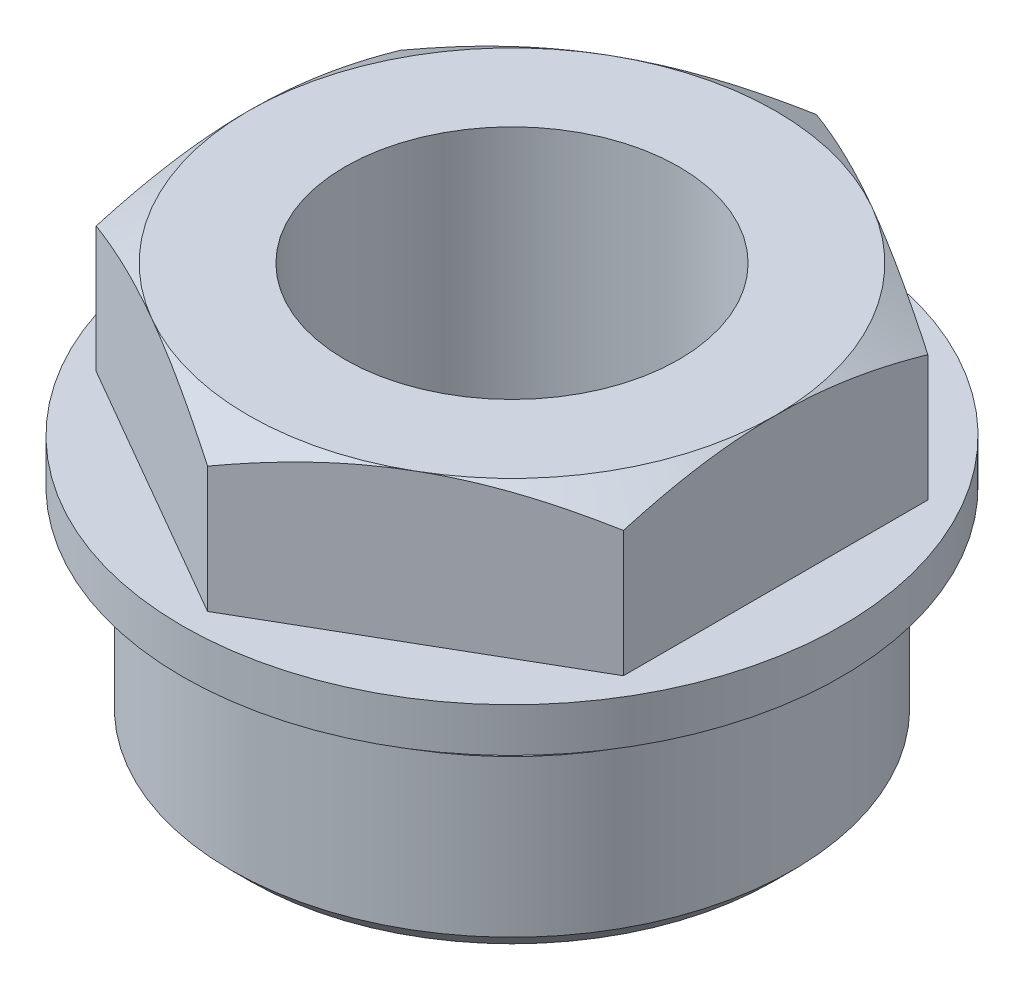
ISO-10303-21;
HEADER;
FILE_DESCRIPTION(('STEP AP214'),'2;1');
FILE_NAME('part.step','',(''),(''),'','','');
FILE_SCHEMA(('AUTOMOTIVE_DESIGN { 1 0 10303 214 1 1 1 1 }'));
ENDSEC;
DATA;
#1=APPLICATION_CONTEXT('core data for automotive mechanical design processes');
#2=APPLICATION_PROTOCOL_DEFINITION('international standard','automotive_design',2000,#1);
#3=PRODUCT_CONTEXT('',#1,'mechanical');
#4=PRODUCT('Part','Part','',(#3));
#5=PRODUCT_RELATED_PRODUCT_CATEGORY('part','',(#4));
#6=PRODUCT_DEFINITION_FORMATION('','',#4);
#7=PRODUCT_DEFINITION_CONTEXT('part definition',#1,'design');
#8=PRODUCT_DEFINITION('design','',#6,#7);
#9=PRODUCT_DEFINITION_SHAPE('','',#8);
#10=(LENGTH_UNIT() NAMED_UNIT(*) SI_UNIT(.MILLI.,.METRE.));
#11=(NAMED_UNIT(*) PLANE_ANGLE_UNIT() SI_UNIT($,.RADIAN.));
#12=(NAMED_UNIT(*) SI_UNIT($,.STERADIAN.) SOLID_ANGLE_UNIT());
#13=UNCERTAINTY_MEASURE_WITH_UNIT(LENGTH_MEASURE(1.E-05),#10,'distance_accuracy_value','');
#14=(GEOMETRIC_REPRESENTATION_CONTEXT(3) GLOBAL_UNCERTAINTY_ASSIGNED_CONTEXT((#13)) GLOBAL_UNIT_ASSIGNED_CONTEXT((#10,
#11,#12)) REPRESENTATION_CONTEXT('',''));
#15=CARTESIAN_POINT('',(0.,0.,0.));
#16=DIRECTION('',(0.,0.,1.));
#17=DIRECTION('',(1.,0.,0.));
#18=AXIS2_PLACEMENT_3D('',#15,#16,#17);
#19=CARTESIAN_POINT('',(26.5000000000003,46.,0.));
#20=DIRECTION('',(0.,-1.,0.));
#21=DIRECTION('',(0.,0.,-1.00000000000001));
#22=AXIS2_PLACEMENT_3D('',#19,#20,#21);
#23=PLANE('',#22);
#24=CARTESIAN_POINT('',(0.,46.,0.));
#25=DIRECTION('',(0.,1.,0.));
#26=DIRECTION('',(0.,0.,1.00000000000001));
#27=AXIS2_PLACEMENT_3D('',#24,#25,#26);
#28=CIRCLE('',#27,19.);
#29=CARTESIAN_POINT('',(0.,46.,19.0000000000002));
#30=VERTEX_POINT('',#29);
#31=EDGE_CURVE('E257',#30,#30,#28,.T.);
#32=ORIENTED_EDGE('',*,*,#31,.F.);
#33=EDGE_LOOP('',(#32));
#34=FACE_BOUND('',#33,.T.);
#35=CARTESIAN_POINT('',(0.,46.,0.));
#36=DIRECTION('',(0.,-1.,0.));
#37=DIRECTION('',(0.,0.,-1.00000000000001));
#38=AXIS2_PLACEMENT_3D('',#35,#36,#37);
#39=CIRCLE('',#38,30.);
#40=CARTESIAN_POINT('',(15.0000000000002,46.,-25.9807621135335));
#41=VERTEX_POINT('',#40);
#42=CARTESIAN_POINT('',(30.0000000000003,46.,0.));
#43=VERTEX_POINT('',#42);
#44=EDGE_CURVE('E55',#41,#43,#39,.T.);
#45=ORIENTED_EDGE('',*,*,#44,.F.);
#46=CARTESIAN_POINT('',(-15.0000000000002,46.,-25.9807621135335));
#47=VERTEX_POINT('',#46);
#48=EDGE_CURVE('E142',#47,#41,#39,.T.);
#49=ORIENTED_EDGE('',*,*,#48,.F.);
#50=CARTESIAN_POINT('',(-30.0000000000003,46.,0.));
#51=VERTEX_POINT('',#50);
#52=EDGE_CURVE('E139',#51,#47,#39,.T.);
#53=ORIENTED_EDGE('',*,*,#52,.F.);
#54=CARTESIAN_POINT('',(-15.0000000000002,46.,25.9807621135335));
#55=VERTEX_POINT('',#54);
#56=EDGE_CURVE('E138',#55,#51,#39,.T.);
#57=ORIENTED_EDGE('',*,*,#56,.F.);
#58=CARTESIAN_POINT('',(15.0000000000002,46.,25.9807621135335));
#59=VERTEX_POINT('',#58);
#60=EDGE_CURVE('E118',#59,#55,#39,.T.);
#61=ORIENTED_EDGE('',*,*,#60,.F.);
#62=EDGE_CURVE('E108',#43,#59,#39,.T.);
#63=ORIENTED_EDGE('',*,*,#62,.F.);
#64=EDGE_LOOP('',(#45,#49,#53,#57,#61,#63));
#65=FACE_BOUND('',#64,.T.);
#66=ADVANCED_FACE('F36',(#34,#65),#23,.F.);
#67=CARTESIAN_POINT('',(30.0000000000003,46.,17.3205080756889));
#68=DIRECTION('',(-1.00000000000001,0.,0.));
#69=DIRECTION('',(0.,0.,1.00000000000001));
#70=AXIS2_PLACEMENT_3D('',#67,#68,#69);
#71=PLANE('',#70);
#72=CARTESIAN_POINT('',(30.0000000000002,31.239606090176,-46.771281964602));
#73=CARTESIAN_POINT('',(30.0000000000003,31.5584687448087,-46.1151297675262));
#74=CARTESIAN_POINT('',(30.0000000000003,31.8757643867477,-45.458213812426));
#75=CARTESIAN_POINT('',(30.0000000000004,32.5068572860206,-44.1426960555677));
#76=CARTESIAN_POINT('',(30.0000000000003,32.8206545089147,-43.4840942372917));
#77=CARTESIAN_POINT('',(30.0000000000003,33.4444271760728,-42.1649593976201));
#78=CARTESIAN_POINT('',(30.0000000000003,33.754402034073,-41.5044260987363));
#79=CARTESIAN_POINT('',(30.0000000000003,34.370043168767,-40.1813574056566));
#80=CARTESIAN_POINT('',(30.0000000000003,34.6757094551644,-39.5188220159738));
#81=CARTESIAN_POINT('',(30.0000000000003,35.5887791275012,-37.5208295363822));
#82=CARTESIAN_POINT('',(30.0000000000003,36.1889082784953,-36.182034464203));
#83=CARTESIAN_POINT('',(30.0000000000003,37.3649692433763,-33.4938786164809));
#84=CARTESIAN_POINT('',(30.0000000000003,37.9409021839277,-32.1445183363718));
#85=CARTESIAN_POINT('',(30.0000000000003,38.7909979851775,-30.0886765711821));
#86=CARTESIAN_POINT('',(30.0000000000003,39.076414808503,-29.3868443951255));
#87=CARTESIAN_POINT('',(30.0000000000003,39.6379415544381,-27.9794711168769));
#88=CARTESIAN_POINT('',(30.0000000000003,39.9140516145169,-27.2739300696465));
#89=CARTESIAN_POINT('',(30.0000000000003,40.4557471475396,-25.8587028040617));
#90=CARTESIAN_POINT('',(30.0000000000003,40.7213311997531,-25.1490160408786));
#91=CARTESIAN_POINT('',(30.0000000000003,41.2404784785449,-23.7252560579688));
#92=CARTESIAN_POINT('',(30.0000000000003,41.4940417532632,-23.0111828558215));
#93=CARTESIAN_POINT('',(30.0000000000003,41.9869978610834,-21.5797436345364));
#94=CARTESIAN_POINT('',(30.0000000000003,42.2264181461269,-20.8623871159705));
#95=CARTESIAN_POINT('',(30.0000000000003,42.6897530114854,-19.4226978318921));
#96=CARTESIAN_POINT('',(30.0000000000003,42.9136673272633,-18.7003649817127));
#97=CARTESIAN_POINT('',(30.0000000000003,43.5589575300168,-16.5258517009774));
#98=CARTESIAN_POINT('',(30.0000000000004,43.9540701330207,-15.0656156625463));
#99=CARTESIAN_POINT('',(30.0000000000003,44.4788191601853,-12.8635430521492));
#100=CARTESIAN_POINT('',(30.0000000000003,44.6420535379972,-12.1296310543223));
#101=CARTESIAN_POINT('',(30.0000000000003,44.9439641262003,-10.656740720355));
#102=CARTESIAN_POINT('',(30.0000000000003,45.0826408291055,-9.91776248612862));
#103=CARTESIAN_POINT('',(30.0000000000003,45.3330012133776,-8.43525328781893));
#104=CARTESIAN_POINT('',(30.0000000000003,45.4446858599883,-7.6917224875119));
#105=CARTESIAN_POINT('',(30.0000000000003,45.6388508580684,-6.2008305879058));
#106=CARTESIAN_POINT('',(30.0000000000003,45.7213312315709,-5.45346949149692));
#107=CARTESIAN_POINT('',(30.0000000000003,45.8543941047252,-3.96587006600817));
#108=CARTESIAN_POINT('',(30.0000000000003,45.9053844576527,-3.22566843529052));
#109=CARTESIAN_POINT('',(30.0000000000003,45.9760031688681,-1.74377072428046));
#110=CARTESIAN_POINT('',(30.0000000000003,45.9956320543404,-1.00207466931907));
#111=CARTESIAN_POINT('',(30.0000000000003,46.003064011847,0.48147630723366));
#112=CARTESIAN_POINT('',(30.0000000000003,45.9908670135501,1.22333122917246));
#113=CARTESIAN_POINT('',(30.0000000000003,45.9349326768345,2.70588775153425));
#114=CARTESIAN_POINT('',(30.0000000000003,45.8911939281505,3.44658929890458));
#115=CARTESIAN_POINT('',(30.0000000000003,45.790980313849,4.7026670134716));
#116=CARTESIAN_POINT('',(30.0000000000003,45.7423151475744,5.21868236424298));
#117=CARTESIAN_POINT('',(30.0000000000003,45.6306254228115,6.249162488353));
#118=CARTESIAN_POINT('',(30.0000000000003,45.5676004736486,6.76362721911927));
#119=CARTESIAN_POINT('',(30.0000000000003,45.357901827873,8.30428874215558));
#120=CARTESIAN_POINT('',(30.0000000000003,45.1906061789717,9.32773034867538));
#121=CARTESIAN_POINT('',(30.0000000000003,44.8069407991702,11.3660247843504));
#122=CARTESIAN_POINT('',(30.0000000000003,44.5905335158632,12.3808704215439));
#123=CARTESIAN_POINT('',(30.0000000000003,44.1152707446624,14.4004832336886));
#124=CARTESIAN_POINT('',(30.0000000000003,43.8564158424032,15.4052505474839));
#125=CARTESIAN_POINT('',(30.0000000000003,43.2964152806086,17.4269084380743));
#126=CARTESIAN_POINT('',(30.0000000000003,42.994457898408,18.4435724953574));
#127=CARTESIAN_POINT('',(30.0000000000003,42.3588523780749,20.4668884277304));
#128=CARTESIAN_POINT('',(30.0000000000003,42.0252040282061,21.473540235876));
#129=CARTESIAN_POINT('',(30.0000000000003,41.3315556576804,23.4773282017245));
#130=CARTESIAN_POINT('',(30.0000000000003,40.9715640722065,24.4744672908279));
#131=CARTESIAN_POINT('',(30.0000000000003,40.4150258557418,25.9639422432158));
#132=CARTESIAN_POINT('',(30.0000000000003,40.226754736205,26.4593947158607));
#133=CARTESIAN_POINT('',(30.0000000000003,39.8451547473928,27.44835136488));
#134=CARTESIAN_POINT('',(30.0000000000003,39.6518258624581,27.9418555352167));
#135=CARTESIAN_POINT('',(30.0000000000003,39.1837723709219,29.1203359232278));
#136=CARTESIAN_POINT('',(30.0000000000003,38.9068787245017,29.8044507215684));
#137=CARTESIAN_POINT('',(30.0000000000003,38.3451610691753,31.1694203789101));
#138=CARTESIAN_POINT('',(30.0000000000003,38.0603369517341,31.850275193146));
#139=CARTESIAN_POINT('',(30.0000000000003,37.1953226039201,33.8884385344728));
#140=CARTESIAN_POINT('',(30.0000000000003,36.6046135218581,35.2412881388175));
#141=CARTESIAN_POINT('',(30.0000000000003,35.4008964816039,37.9373671896757));
#142=CARTESIAN_POINT('',(30.0000000000003,34.7878832368942,39.2805942639723));
#143=CARTESIAN_POINT('',(30.0000000000003,33.5440976205147,41.9587483647648));
#144=CARTESIAN_POINT('',(30.0000000000003,32.9133256560292,43.2936755807102));
#145=CARTESIAN_POINT('',(30.0000000000003,31.6366598219089,45.9581494443461));
#146=CARTESIAN_POINT('',(30.0000000000003,30.9907494270811,47.2876881579736));
#147=CARTESIAN_POINT('',(30.0000000000003,29.687118983031,49.9409628653108));
#148=CARTESIAN_POINT('',(30.0000000000003,29.0293988792444,51.2646988321751));
#149=CARTESIAN_POINT('',(30.0000000000003,27.7042847418027,53.9070912285462));
#150=CARTESIAN_POINT('',(30.0000000000003,27.0368920227888,55.2257483180708));
#151=CARTESIAN_POINT('',(30.0000000000003,25.6939585976239,57.858900093837));
#152=CARTESIAN_POINT('',(30.0000000000003,25.018417907617,59.1733947883192));
#153=CARTESIAN_POINT('',(30.0000000000003,23.7186547125147,61.6863411406713));
#154=CARTESIAN_POINT('',(30.0000000000003,23.0949952422963,62.8850842385074));
#155=CARTESIAN_POINT('',(30.0000000000003,21.842727248606,65.2799834863159));
#156=CARTESIAN_POINT('',(30.0000000000003,21.214118717146,66.4761396321087));
#157=CARTESIAN_POINT('',(30.0000000000003,19.3218480221742,70.061314111693));
#158=CARTESIAN_POINT('',(30.0000000000003,18.0517840515526,72.44695502357));
#159=CARTESIAN_POINT('',(30.0000000000003,16.1385812103086,76.0170792666997));
#160=CARTESIAN_POINT('',(30.0000000000003,15.5003323985776,77.204190267003));
#161=CARTESIAN_POINT('',(30.0000000000003,14.2209596587581,79.5768632930374));
#162=CARTESIAN_POINT('',(30.0000000000003,13.5798357296873,80.7624253182392));
#163=CARTESIAN_POINT('',(30.0000000000003,12.2950866509175,83.132104675254));
#164=CARTESIAN_POINT('',(30.0000000000003,11.6514616468601,84.3162220860656));
#165=CARTESIAN_POINT('',(30.0000000000003,10.3619460879778,86.6832203951816));
#166=CARTESIAN_POINT('',(30.0000000000003,9.71605553666151,87.8661012953972));
#167=CARTESIAN_POINT('',(30.0000000000003,9.06916733564153,89.0484357879374));
#168=B_SPLINE_CURVE_WITH_KNOTS('',3,(#72,#73,#74,#75,#76,#77,#78,#79,#80,#81,#82,#83,#84,#85,
#86,#87,#88,#89,#90,#91,#92,#93,#94,#95,#96,#97,#98,#99,#100,#101,#102,#103,#104,#105,#106,#107,
#108,#109,#110,#111,#112,#113,#114,#115,#116,#117,#118,#119,#120,#121,#122,#123,#124,#125,#126,
#127,#128,#129,#130,#131,#132,#133,#134,#135,#136,#137,#138,#139,#140,#141,#142,#143,#144,#145,
#146,#147,#148,#149,#150,#151,#152,#153,#154,#155,#156,#157,#158,#159,#160,#161,#162,#163,#164,
#165,#166,#167),.UNSPECIFIED.,.F.,.F.,(4,2,2,2,2,2,2,2,2,2,2,2,2,2,2,2,2,2,2,2,2,2,2,2,2,2,2,2,
2,2,2,2,2,2,2,2,2,2,2,2,2,2,2,2,2,2,2,4),(0.,2.18858068266817,4.37718289159747,6.56611670840003,
8.75504559458203,13.1563067705084,17.5573627798744,19.8302541446687,22.1031119220881,
24.3762754371638,26.6494298480529,28.9180162945693,31.1866414344311,35.7221738109184,
37.9773813752812,40.2325437054497,42.4876253784292,44.7427053500613,46.9679292743306,
49.193115792336,51.4183072277247,53.6435981599668,55.1983161665016,56.7530764760177,
59.8626647795075,62.9746388381712,66.0865699656557,69.2676306215485,72.4487125325013,
75.6287802713504,77.2188126469497,78.8088499460207,81.0228697118071,83.2369197931499,
87.6652067600133,92.094550242666,96.5237922488252,100.958117904936,105.392464054176,
109.826213063957,114.2599532904,118.313756266674,122.367565787572,130.475466895434,
134.518897380069,138.56232924618,142.605529083621,146.648722662373),.UNSPECIFIED.);
#169=CARTESIAN_POINT('',(30.0000000000003,43.3205080756888,17.3205080756889));
#170=VERTEX_POINT('',#169);
#171=EDGE_CURVE('E114',#170,#43,#168,.F.);
#172=ORIENTED_EDGE('',*,*,#171,.F.);
#173=DIRECTION('',(0.,-1.,0.));
#174=VECTOR('',#173,1.);
#175=CARTESIAN_POINT('',(30.0000000000004,137.651513899117,17.320508075689));
#176=LINE('',#175,#174);
#177=CARTESIAN_POINT('',(30.0000000000003,29.,17.3205080756889));
#178=VERTEX_POINT('',#177);
#179=EDGE_CURVE('E134',#170,#178,#176,.T.);
#180=ORIENTED_EDGE('',*,*,#179,.T.);
#181=DIRECTION('',(0.,0.,-1.00000000000001));
#182=VECTOR('',#181,1.);
#183=CARTESIAN_POINT('',(30.0000000000003,29.,17.3205080756889));
#184=LINE('',#183,#182);
#185=CARTESIAN_POINT('',(30.0000000000002,29.,-17.320508075689));
#186=VERTEX_POINT('',#185);
#187=EDGE_CURVE('E254',#178,#186,#184,.T.);
#188=ORIENTED_EDGE('',*,*,#187,.T.);
#189=DIRECTION('',(0.,-1.,0.));
#190=VECTOR('',#189,1.);
#191=CARTESIAN_POINT('',(30.0000000000003,137.651513899117,-17.3205080756889));
#192=LINE('',#191,#190);
#193=CARTESIAN_POINT('',(30.0000000000003,43.3205080756888,-17.320508075689));
#194=VERTEX_POINT('',#193);
#195=EDGE_CURVE('E302',#194,#186,#192,.T.);
#196=ORIENTED_EDGE('',*,*,#195,.F.);
#197=EDGE_CURVE('E149',#43,#194,#168,.F.);
#198=ORIENTED_EDGE('',*,*,#197,.F.);
#199=EDGE_LOOP('',(#172,#180,#188,#196,#198));
#200=FACE_BOUND('',#199,.T.);
#201=ADVANCED_FACE('F165',(#200),#71,.F.);
#202=CARTESIAN_POINT('',(0.,46.,34.6410161513779));
#203=DIRECTION('',(-0.500000000000006,0.,-0.86602540378445));
#204=DIRECTION('',(-0.866025403784449,0.,0.500000000000006));
#205=AXIS2_PLACEMENT_3D('',#202,#203,#204);
#206=PLANE('',#205);
#207=CARTESIAN_POINT('',(-0.00019999999998812,43.3204414086888,34.6411316214317));
#208=CARTESIAN_POINT('',(0.659186525557419,43.5402203311054,34.2604346334012));
#209=CARTESIAN_POINT('',(1.32114500943039,43.7500259061145,33.8782527245448));
#210=CARTESIAN_POINT('',(2.65037008425808,44.1469181469042,33.1108242697794));
#211=CARTESIAN_POINT('',(3.31763834458855,44.3339973405019,32.7255767600559));
#212=CARTESIAN_POINT('',(4.65878677635737,44.6829257656525,31.9512643519509));
#213=CARTESIAN_POINT('',(5.33267879099744,44.8447147472276,31.5621926158937));
#214=CARTESIAN_POINT('',(6.68511676114634,45.1395774383582,30.781362189766));
#215=CARTESIAN_POINT('',(7.36366224608094,45.2726540084859,30.3896037713816));
#216=CARTESIAN_POINT('',(8.70806302803095,45.504442984088,29.613413618024));
#217=CARTESIAN_POINT('',(9.3738186050033,45.603921918691,29.2290394564445));
#218=CARTESIAN_POINT('',(10.7083802826267,45.7707251166871,28.4585299126185));
#219=CARTESIAN_POINT('',(11.3771864417479,45.8380487611265,28.0723944966142));
#220=CARTESIAN_POINT('',(12.7159221665994,45.93884151169,27.2994750654974));
#221=CARTESIAN_POINT('',(13.3858494453991,45.9723508463517,26.9126923707449));
#222=CARTESIAN_POINT('',(14.7263223205434,46.0047942931646,26.138769995439));
#223=CARTESIAN_POINT('',(15.3968678971404,46.003729473752,25.7516303262869));
#224=CARTESIAN_POINT('',(16.6504595037051,45.9694399503114,25.0278688747829));
#225=CARTESIAN_POINT('',(17.2335948812431,45.9403965385324,24.6911955075873));
#226=CARTESIAN_POINT('',(18.3984749190377,45.8567123805129,24.0186517041929));
#227=CARTESIAN_POINT('',(18.9802195990947,45.8020720009267,23.6827812565624));
#228=CARTESIAN_POINT('',(20.1420964286622,45.6681440818064,23.0119713562464));
#229=CARTESIAN_POINT('',(20.7222266395141,45.5888342550569,22.677033022846));
#230=CARTESIAN_POINT('',(21.8797295892507,45.4069590542183,22.0087483832278));
#231=CARTESIAN_POINT('',(22.457102339807,45.3043937786526,21.6754020702714));
#232=CARTESIAN_POINT('',(23.6213483105996,45.0751250350096,21.0032243456314));
#233=CARTESIAN_POINT('',(24.2081498990517,44.9479386998341,20.6644342905776));
#234=CARTESIAN_POINT('',(25.3781615843231,44.6728211494682,19.9889277291312));
#235=CARTESIAN_POINT('',(25.9613711831921,44.5248871227584,19.6522115102302));
#236=CARTESIAN_POINT('',(27.1228313254681,44.2105128814924,18.9816421844341));
#237=CARTESIAN_POINT('',(27.7010892596952,44.044108880287,18.647784810447));
#238=CARTESIAN_POINT('',(28.8536055653689,43.694454808662,17.9823792111209));
#239=CARTESIAN_POINT('',(29.4278650152744,43.5112094862417,17.6508303631333));
#240=CARTESIAN_POINT('',(30.0002000000003,43.3204414086888,17.3203926056351));
#241=B_SPLINE_CURVE_WITH_KNOTS('',3,(#207,#208,#209,#210,#211,#212,#213,#214,#215,#216,#217,
#218,#219,#220,#221,#222,#223,#224,#225,#226,#227,#228,#229,#230,#231,#232,#233,#234,#235,#236,
#237,#238,#239,#240),.UNSPECIFIED.,.F.,.F.,(4,2,2,2,2,2,2,2,2,2,2,2,2,2,2,2,4),(0.,
2.37750032904935,4.75578025029283,7.13964242705027,9.52326699360546,11.8481083974673,
14.1729945501431,16.4951115370996,18.8171567643376,20.8385880600119,22.8599904013275,
24.8832242763789,26.9064495800129,28.9743372865568,31.0425054837892,33.1066880391165,
35.1702904233235),.UNSPECIFIED.);
#242=CARTESIAN_POINT('',(0.,43.3205080756888,34.6410161513779));
#243=VERTEX_POINT('',#242);
#244=EDGE_CURVE('E122',#243,#59,#241,.T.);
#245=ORIENTED_EDGE('',*,*,#244,.F.);
#246=DIRECTION('',(0.,-1.,0.));
#247=VECTOR('',#246,1.);
#248=CARTESIAN_POINT('',(0.,137.651513899117,34.6410161513777));
#249=LINE('',#248,#247);
#250=CARTESIAN_POINT('',(0.,29.,34.6410161513779));
#251=VERTEX_POINT('',#250);
#252=EDGE_CURVE('E309',#243,#251,#249,.T.);
#253=ORIENTED_EDGE('',*,*,#252,.T.);
#254=DIRECTION('',(0.86602540378445,0.,-0.500000000000006));
#255=VECTOR('',#254,1.);
#256=CARTESIAN_POINT('',(0.,29.,34.6410161513779));
#257=LINE('',#256,#255);
#258=EDGE_CURVE('E260',#251,#178,#257,.T.);
#259=ORIENTED_EDGE('',*,*,#258,.T.);
#260=ORIENTED_EDGE('',*,*,#179,.F.);
#261=EDGE_CURVE('E112',#59,#170,#241,.T.);
#262=ORIENTED_EDGE('',*,*,#261,.F.);
#263=EDGE_LOOP('',(#245,#253,#259,#260,#262));
#264=FACE_BOUND('',#263,.T.);
#265=ADVANCED_FACE('F132',(#264),#206,.F.);
#266=CARTESIAN_POINT('',(-30.0000000000003,46.,17.3205080756889));
#267=DIRECTION('',(0.500000000000005,0.,-0.86602540378445));
#268=DIRECTION('',(-0.86602540378445,0.,-0.500000000000006));
#269=AXIS2_PLACEMENT_3D('',#266,#267,#268);
#270=PLANE('',#269);
#271=CARTESIAN_POINT('',(-30.0002000000003,43.3204414086888,17.3203926056351));
#272=CARTESIAN_POINT('',(-29.3408134744429,43.5402203311054,17.7010895936657));
#273=CARTESIAN_POINT('',(-28.6788549905699,43.7500259061145,18.0832715025221));
#274=CARTESIAN_POINT('',(-27.3496299157422,44.1469181469042,18.8506999572875));
#275=CARTESIAN_POINT('',(-26.6823616554118,44.3339973405019,19.235947467011));
#276=CARTESIAN_POINT('',(-25.3412132236429,44.6829257656525,20.010259875116));
#277=CARTESIAN_POINT('',(-24.6673212090029,44.8447147472276,20.3993316111731));
#278=CARTESIAN_POINT('',(-23.314883238854,45.1395774383582,21.1801620373009));
#279=CARTESIAN_POINT('',(-22.6363377539194,45.2726540084859,21.5719204556853));
#280=CARTESIAN_POINT('',(-21.2919369719693,45.504442984088,22.3481106090429));
#281=CARTESIAN_POINT('',(-20.626181394997,45.603921918691,22.7324847706223));
#282=CARTESIAN_POINT('',(-19.2916197173736,45.7707251166871,23.5029943144484));
#283=CARTESIAN_POINT('',(-18.6228135582524,45.8380487611265,23.8891297304527));
#284=CARTESIAN_POINT('',(-17.2840778334009,45.93884151169,24.6620491615694));
#285=CARTESIAN_POINT('',(-16.6141505546011,45.9723508463517,25.0488318563219));
#286=CARTESIAN_POINT('',(-15.2736776794569,46.0047942931646,25.8227542316279));
#287=CARTESIAN_POINT('',(-14.6031321028599,46.003729473752,26.2098939007802));
#288=CARTESIAN_POINT('',(-13.3495404962953,45.9694399503114,26.9336553522841));
#289=CARTESIAN_POINT('',(-12.7664051187571,45.9403965385324,27.2703287194797));
#290=CARTESIAN_POINT('',(-11.6015250809626,45.8567123805129,27.9428725228739));
#291=CARTESIAN_POINT('',(-11.0197804009056,45.8020720009267,28.2787429705045));
#292=CARTESIAN_POINT('',(-9.85790357133807,45.6681440818064,28.9495528708205));
#293=CARTESIAN_POINT('',(-9.27777336048615,45.5888342550569,29.2844912042209));
#294=CARTESIAN_POINT('',(-8.12027041074954,45.4069590542183,29.9527758438391));
#295=CARTESIAN_POINT('',(-7.54289766019324,45.3043937786526,30.2861221567955));
#296=CARTESIAN_POINT('',(-6.37865168940074,45.0751250350097,30.9582998814355));
#297=CARTESIAN_POINT('',(-5.79185010094863,44.9479386998341,31.2970899364892));
#298=CARTESIAN_POINT('',(-4.62183841567716,44.6728211494683,31.9725964979357));
#299=CARTESIAN_POINT('',(-4.03862881680819,44.5248871227585,32.3093127168367));
#300=CARTESIAN_POINT('',(-2.87716867453222,44.2105128814924,32.9798820426327));
#301=CARTESIAN_POINT('',(-2.29891074030506,44.0441088802871,33.3137394166198));
#302=CARTESIAN_POINT('',(-1.14639443463145,43.694454808662,33.9791450159459));
#303=CARTESIAN_POINT('',(-0.572134984725904,43.5112094862418,34.3106938639336));
#304=CARTESIAN_POINT('',(0.000200000000012979,43.3204414086888,34.6411316214318));
#305=B_SPLINE_CURVE_WITH_KNOTS('',3,(#271,#272,#273,#274,#275,#276,#277,#278,#279,#280,#281,
#282,#283,#284,#285,#286,#287,#288,#289,#290,#291,#292,#293,#294,#295,#296,#297,#298,#299,#300,
#301,#302,#303,#304),.UNSPECIFIED.,.F.,.F.,(4,2,2,2,2,2,2,2,2,2,2,2,2,2,2,2,4),(0.,
2.37750032904936,4.75578025029286,7.1396424270503,9.5232669936055,11.8481083974673,
14.1729945501431,16.4951115370996,18.8171567643377,20.8385880600119,22.8599904013276,
24.8832242763789,26.9064495800129,28.9743372865568,31.0425054837892,33.1066880391165,
35.1702904233236),.UNSPECIFIED.);
#306=CARTESIAN_POINT('',(-30.0000000000003,43.3205080756888,17.320508075689));
#307=VERTEX_POINT('',#306);
#308=EDGE_CURVE('E305',#307,#55,#305,.T.);
#309=ORIENTED_EDGE('',*,*,#308,.F.);
#310=DIRECTION('',(0.,-1.,0.));
#311=VECTOR('',#310,1.);
#312=CARTESIAN_POINT('',(-30.0000000000003,137.651513899117,17.320508075689));
#313=LINE('',#312,#311);
#314=CARTESIAN_POINT('',(-30.0000000000004,29.,17.320508075689));
#315=VERTEX_POINT('',#314);
#316=EDGE_CURVE('E303',#307,#315,#313,.T.);
#317=ORIENTED_EDGE('',*,*,#316,.T.);
#318=DIRECTION('',(0.86602540378445,0.,0.500000000000006));
#319=VECTOR('',#318,1.);
#320=CARTESIAN_POINT('',(-30.0000000000004,29.,17.3205080756889));
#321=LINE('',#320,#319);
#322=EDGE_CURVE('E318',#315,#251,#321,.T.);
#323=ORIENTED_EDGE('',*,*,#322,.T.);
#324=ORIENTED_EDGE('',*,*,#252,.F.);
#325=EDGE_CURVE('E126',#55,#243,#305,.T.);
#326=ORIENTED_EDGE('',*,*,#325,.F.);
#327=EDGE_LOOP('',(#309,#317,#323,#324,#326));
#328=FACE_BOUND('',#327,.T.);
#329=ADVANCED_FACE('F187',(#328),#270,.F.);
#330=CARTESIAN_POINT('',(-30.0000000000003,46.,-17.3205080756889));
#331=DIRECTION('',(1.00000000000001,0.,0.));
#332=DIRECTION('',(0.,0.,-1.00000000000001));
#333=AXIS2_PLACEMENT_3D('',#330,#331,#332);
#334=PLANE('',#333);
#335=CARTESIAN_POINT('',(-30.0000000000004,31.239606090176,-46.771281964602));
#336=CARTESIAN_POINT('',(-30.0000000000004,31.5584687448087,-46.1151297675262));
#337=CARTESIAN_POINT('',(-30.0000000000004,31.8757643867477,-45.458213812426));
#338=CARTESIAN_POINT('',(-30.0000000000003,32.5068572860206,-44.1426960555677));
#339=CARTESIAN_POINT('',(-30.0000000000003,32.8206545089147,-43.4840942372917));
#340=CARTESIAN_POINT('',(-30.0000000000003,33.4444271760728,-42.1649593976201));
#341=CARTESIAN_POINT('',(-30.0000000000003,33.754402034073,-41.5044260987363));
#342=CARTESIAN_POINT('',(-30.0000000000003,34.370043168767,-40.1813574056566));
#343=CARTESIAN_POINT('',(-30.0000000000003,34.6757094551644,-39.5188220159738));
#344=CARTESIAN_POINT('',(-30.0000000000003,35.5887791275012,-37.5208295363822));
#345=CARTESIAN_POINT('',(-30.0000000000003,36.1889082784953,-36.182034464203));
#346=CARTESIAN_POINT('',(-30.0000000000003,37.3649692433763,-33.4938786164809));
#347=CARTESIAN_POINT('',(-30.0000000000003,37.9409021839277,-32.1445183363717));
#348=CARTESIAN_POINT('',(-30.0000000000003,38.7909979851775,-30.0886765711821));
#349=CARTESIAN_POINT('',(-30.0000000000003,39.076414808503,-29.3868443951255));
#350=CARTESIAN_POINT('',(-30.0000000000003,39.6379415544381,-27.9794711168769));
#351=CARTESIAN_POINT('',(-30.0000000000003,39.9140516145169,-27.2739300696465));
#352=CARTESIAN_POINT('',(-30.0000000000003,40.4557471475396,-25.8587028040617));
#353=CARTESIAN_POINT('',(-30.0000000000003,40.7213311997531,-25.1490160408786));
#354=CARTESIAN_POINT('',(-30.0000000000003,41.2404784785449,-23.7252560579688));
#355=CARTESIAN_POINT('',(-30.0000000000003,41.4940417532632,-23.0111828558215));
#356=CARTESIAN_POINT('',(-30.0000000000003,41.9869978610834,-21.5797436345363));
#357=CARTESIAN_POINT('',(-30.0000000000003,42.2264181461269,-20.8623871159705));
#358=CARTESIAN_POINT('',(-30.0000000000003,42.6897530114854,-19.4226978318921));
#359=CARTESIAN_POINT('',(-30.0000000000003,42.9136673272633,-18.7003649817126));
#360=CARTESIAN_POINT('',(-30.0000000000003,43.5589575300168,-16.5258517009774));
#361=CARTESIAN_POINT('',(-30.0000000000003,43.9540701330207,-15.0656156625463));
#362=CARTESIAN_POINT('',(-30.0000000000003,44.4788191601853,-12.8635430521492));
#363=CARTESIAN_POINT('',(-30.0000000000003,44.6420535379971,-12.1296310543223));
#364=CARTESIAN_POINT('',(-30.0000000000003,44.9439641262003,-10.6567407203549));
#365=CARTESIAN_POINT('',(-30.0000000000003,45.0826408291055,-9.9177624861286));
#366=CARTESIAN_POINT('',(-30.0000000000003,45.3330012133776,-8.43525328781891));
#367=CARTESIAN_POINT('',(-30.0000000000003,45.4446858599883,-7.69172248751187));
#368=CARTESIAN_POINT('',(-30.0000000000003,45.6388508580684,-6.20083058790577));
#369=CARTESIAN_POINT('',(-30.0000000000003,45.7213312315709,-5.4534694914969));
#370=CARTESIAN_POINT('',(-30.0000000000003,45.8543941047252,-3.96587006600815));
#371=CARTESIAN_POINT('',(-30.0000000000003,45.9053844576527,-3.2256684352905));
#372=CARTESIAN_POINT('',(-30.0000000000003,45.9760031688681,-1.74377072428044));
#373=CARTESIAN_POINT('',(-30.0000000000003,45.9956320543404,-1.00207466931906));
#374=CARTESIAN_POINT('',(-30.0000000000003,46.003064011847,0.481476307233678));
#375=CARTESIAN_POINT('',(-30.0000000000003,45.9908670135501,1.22333122917248));
#376=CARTESIAN_POINT('',(-30.0000000000003,45.9349326768345,2.70588775153427));
#377=CARTESIAN_POINT('',(-30.0000000000004,45.8911939281505,3.4465892989046));
#378=CARTESIAN_POINT('',(-30.0000000000004,45.790980313849,4.70266701347162));
#379=CARTESIAN_POINT('',(-30.0000000000003,45.7423151475744,5.218682364243));
#380=CARTESIAN_POINT('',(-30.0000000000003,45.6306254228115,6.24916248835302));
#381=CARTESIAN_POINT('',(-30.0000000000003,45.5676004736486,6.76362721911929));
#382=CARTESIAN_POINT('',(-30.0000000000003,45.357901827873,8.3042887421556));
#383=CARTESIAN_POINT('',(-30.0000000000003,45.1906061789717,9.3277303486754));
#384=CARTESIAN_POINT('',(-30.0000000000003,44.8069407991702,11.3660247843504));
#385=CARTESIAN_POINT('',(-30.0000000000003,44.5905335158632,12.3808704215439));
#386=CARTESIAN_POINT('',(-30.0000000000003,44.1152707446624,14.4004832336887));
#387=CARTESIAN_POINT('',(-30.0000000000003,43.8564158424031,15.405250547484));
#388=CARTESIAN_POINT('',(-30.0000000000003,43.2964152806086,17.4269084380744));
#389=CARTESIAN_POINT('',(-30.0000000000004,42.994457898408,18.4435724953575));
#390=CARTESIAN_POINT('',(-30.0000000000004,42.3588523780749,20.4668884277304));
#391=CARTESIAN_POINT('',(-30.0000000000004,42.0252040282061,21.473540235876));
#392=CARTESIAN_POINT('',(-30.0000000000004,41.3315556576803,23.4773282017246));
#393=CARTESIAN_POINT('',(-30.0000000000003,40.9715640722065,24.4744672908279));
#394=CARTESIAN_POINT('',(-30.0000000000004,40.4150258557418,25.9639422432159));
#395=CARTESIAN_POINT('',(-30.0000000000004,40.226754736205,26.4593947158608));
#396=CARTESIAN_POINT('',(-30.0000000000003,39.8451547473928,27.44835136488));
#397=CARTESIAN_POINT('',(-30.0000000000003,39.6518258624581,27.9418555352168));
#398=CARTESIAN_POINT('',(-30.0000000000003,39.1837723709218,29.1203359232278));
#399=CARTESIAN_POINT('',(-30.0000000000003,38.9068787245017,29.8044507215685));
#400=CARTESIAN_POINT('',(-30.0000000000004,38.3451610691753,31.1694203789102));
#401=CARTESIAN_POINT('',(-30.0000000000004,38.0603369517341,31.850275193146));
#402=CARTESIAN_POINT('',(-30.0000000000003,37.19532260392,33.8884385344729));
#403=CARTESIAN_POINT('',(-30.0000000000004,36.6046135218581,35.2412881388175));
#404=CARTESIAN_POINT('',(-30.0000000000004,35.4008964816039,37.9373671896758));
#405=CARTESIAN_POINT('',(-30.0000000000004,34.7878832368941,39.2805942639724));
#406=CARTESIAN_POINT('',(-30.0000000000004,33.5440976205146,41.9587483647649));
#407=CARTESIAN_POINT('',(-30.0000000000004,32.9133256560291,43.2936755807103));
#408=CARTESIAN_POINT('',(-30.0000000000004,31.6366598219089,45.9581494443462));
#409=CARTESIAN_POINT('',(-30.0000000000004,30.9907494270811,47.2876881579736));
#410=CARTESIAN_POINT('',(-30.0000000000004,29.687118983031,49.9409628653109));
#411=CARTESIAN_POINT('',(-30.0000000000004,29.0293988792444,51.2646988321752));
#412=CARTESIAN_POINT('',(-30.0000000000004,27.7042847418027,53.9070912285462));
#413=CARTESIAN_POINT('',(-30.0000000000004,27.0368920227887,55.2257483180709));
#414=CARTESIAN_POINT('',(-30.0000000000004,25.6939585976239,57.8589000938371));
#415=CARTESIAN_POINT('',(-30.0000000000004,25.018417907617,59.1733947883192));
#416=CARTESIAN_POINT('',(-30.0000000000004,23.7186547125147,61.6863411406714));
#417=CARTESIAN_POINT('',(-30.0000000000004,23.0949952422962,62.8850842385075));
#418=CARTESIAN_POINT('',(-30.0000000000004,21.842727248606,65.2799834863159));
#419=CARTESIAN_POINT('',(-30.0000000000004,21.2141187171459,66.4761396321087));
#420=CARTESIAN_POINT('',(-30.0000000000004,19.3218480221742,70.0613141116931));
#421=CARTESIAN_POINT('',(-30.0000000000004,18.0517840515526,72.44695502357));
#422=CARTESIAN_POINT('',(-30.0000000000004,16.1385812103086,76.0170792666997));
#423=CARTESIAN_POINT('',(-30.0000000000004,15.5003323985776,77.2041902670031));
#424=CARTESIAN_POINT('',(-30.0000000000004,14.2209596587581,79.5768632930375));
#425=CARTESIAN_POINT('',(-30.0000000000004,13.5798357296873,80.7624253182392));
#426=CARTESIAN_POINT('',(-30.0000000000003,12.2950866509175,83.132104675254));
#427=CARTESIAN_POINT('',(-30.0000000000003,11.6514616468601,84.3162220860656));
#428=CARTESIAN_POINT('',(-30.0000000000004,10.3619460879778,86.6832203951816));
#429=CARTESIAN_POINT('',(-30.0000000000004,9.71605553666149,87.8661012953973));
#430=CARTESIAN_POINT('',(-30.0000000000004,9.06916733564152,89.0484357879374));
#431=B_SPLINE_CURVE_WITH_KNOTS('',3,(#335,#336,#337,#338,#339,#340,#341,#342,#343,#344,#345,
#346,#347,#348,#349,#350,#351,#352,#353,#354,#355,#356,#357,#358,#359,#360,#361,#362,#363,#364,
#365,#366,#367,#368,#369,#370,#371,#372,#373,#374,#375,#376,#377,#378,#379,#380,#381,#382,#383,
#384,#385,#386,#387,#388,#389,#390,#391,#392,#393,#394,#395,#396,#397,#398,#399,#400,#401,#402,
#403,#404,#405,#406,#407,#408,#409,#410,#411,#412,#413,#414,#415,#416,#417,#418,#419,#420,#421,
#422,#423,#424,#425,#426,#427,#428,#429,#430),.UNSPECIFIED.,.F.,.F.,(4,2,2,2,2,2,2,2,2,2,2,2,2,
2,2,2,2,2,2,2,2,2,2,2,2,2,2,2,2,2,2,2,2,2,2,2,2,2,2,2,2,2,2,2,2,2,2,4),(0.,2.18858068266817,
4.37718289159746,6.56611670840002,8.75504559458202,13.1563067705084,17.5573627798744,
19.8302541446687,22.1031119220881,24.3762754371638,26.6494298480529,28.9180162945693,
31.1866414344311,35.7221738109184,37.9773813752812,40.2325437054497,42.4876253784292,
44.7427053500614,46.9679292743306,49.193115792336,51.4183072277247,53.6435981599668,
55.1983161665016,56.7530764760177,59.8626647795075,62.9746388381712,66.0865699656557,
69.2676306215486,72.4487125325013,75.6287802713505,77.2188126469498,78.8088499460208,
81.0228697118071,83.2369197931499,87.6652067600134,92.094550242666,96.5237922488252,
100.958117904936,105.392464054176,109.826213063957,114.2599532904,118.313756266674,
122.367565787573,130.475466895435,134.518897380069,138.56232924618,142.605529083621,
146.648722662373),.UNSPECIFIED.);
#432=CARTESIAN_POINT('',(-30.0000000000003,43.3205080756888,-17.3205080756889));
#433=VERTEX_POINT('',#432);
#434=EDGE_CURVE('E135',#433,#51,#431,.T.);
#435=ORIENTED_EDGE('',*,*,#434,.F.);
#436=DIRECTION('',(0.,-1.,0.));
#437=VECTOR('',#436,1.);
#438=CARTESIAN_POINT('',(-30.0000000000003,137.651513899117,-17.3205080756889));
#439=LINE('',#438,#437);
#440=CARTESIAN_POINT('',(-30.0000000000004,29.,-17.320508075689));
#441=VERTEX_POINT('',#440);
#442=EDGE_CURVE('E301',#433,#441,#439,.T.);
#443=ORIENTED_EDGE('',*,*,#442,.T.);
#444=DIRECTION('',(0.,0.,1.00000000000001));
#445=VECTOR('',#444,1.);
#446=CARTESIAN_POINT('',(-30.0000000000004,29.,-17.3205080756889));
#447=LINE('',#446,#445);
#448=EDGE_CURVE('E315',#441,#315,#447,.T.);
#449=ORIENTED_EDGE('',*,*,#448,.T.);
#450=ORIENTED_EDGE('',*,*,#316,.F.);
#451=EDGE_CURVE('E129',#51,#307,#431,.T.);
#452=ORIENTED_EDGE('',*,*,#451,.F.);
#453=EDGE_LOOP('',(#435,#443,#449,#450,#452));
#454=FACE_BOUND('',#453,.T.);
#455=ADVANCED_FACE('F190',(#454),#334,.F.);
#456=CARTESIAN_POINT('',(0.,46.,-34.6410161513779));
#457=DIRECTION('',(0.500000000000006,0.,0.86602540378445));
#458=DIRECTION('',(0.86602540378445,0.,-0.500000000000006));
#459=AXIS2_PLACEMENT_3D('',#456,#457,#458);
#460=PLANE('',#459);
#461=CARTESIAN_POINT('',(0.000199999999988693,43.3204414086888,-34.6411316214317));
#462=CARTESIAN_POINT('',(-0.659186525557418,43.5402203311054,-34.2604346334012));
#463=CARTESIAN_POINT('',(-1.32114500943039,43.7500259061145,-33.8782527245448));
#464=CARTESIAN_POINT('',(-2.65037008425808,44.1469181469042,-33.1108242697794));
#465=CARTESIAN_POINT('',(-3.31763834458855,44.3339973405019,-32.7255767600559));
#466=CARTESIAN_POINT('',(-4.65878677635737,44.6829257656525,-31.9512643519509));
#467=CARTESIAN_POINT('',(-5.33267879099744,44.8447147472276,-31.5621926158937));
#468=CARTESIAN_POINT('',(-6.68511676114633,45.1395774383582,-30.781362189766));
#469=CARTESIAN_POINT('',(-7.36366224608094,45.2726540084859,-30.3896037713816));
#470=CARTESIAN_POINT('',(-8.70806302803094,45.504442984088,-29.613413618024));
#471=CARTESIAN_POINT('',(-9.3738186050033,45.603921918691,-29.2290394564445));
#472=CARTESIAN_POINT('',(-10.7083802826267,45.7707251166871,-28.4585299126185));
#473=CARTESIAN_POINT('',(-11.3771864417479,45.8380487611265,-28.0723944966142));
#474=CARTESIAN_POINT('',(-12.7159221665994,45.93884151169,-27.2994750654975));
#475=CARTESIAN_POINT('',(-13.3858494453991,45.9723508463517,-26.9126923707449));
#476=CARTESIAN_POINT('',(-14.7263223205434,46.0047942931646,-26.138769995439));
#477=CARTESIAN_POINT('',(-15.3968678971404,46.003729473752,-25.7516303262869));
#478=CARTESIAN_POINT('',(-16.6504595037051,45.9694399503114,-25.0278688747829));
#479=CARTESIAN_POINT('',(-17.2335948812431,45.9403965385324,-24.6911955075873));
#480=CARTESIAN_POINT('',(-18.3984749190377,45.8567123805129,-24.0186517041929));
#481=CARTESIAN_POINT('',(-18.9802195990947,45.8020720009267,-23.6827812565624));
#482=CARTESIAN_POINT('',(-20.1420964286622,45.6681440818064,-23.0119713562464));
#483=CARTESIAN_POINT('',(-20.7222266395141,45.5888342550569,-22.677033022846));
#484=CARTESIAN_POINT('',(-21.8797295892507,45.4069590542183,-22.0087483832278));
#485=CARTESIAN_POINT('',(-22.457102339807,45.3043937786526,-21.6754020702714));
#486=CARTESIAN_POINT('',(-23.6213483105995,45.0751250350096,-21.0032243456314));
#487=CARTESIAN_POINT('',(-24.2081498990517,44.9479386998341,-20.6644342905776));
#488=CARTESIAN_POINT('',(-25.3781615843231,44.6728211494682,-19.9889277291312));
#489=CARTESIAN_POINT('',(-25.9613711831921,44.5248871227584,-19.6522115102302));
#490=CARTESIAN_POINT('',(-27.1228313254681,44.2105128814924,-18.9816421844341));
#491=CARTESIAN_POINT('',(-27.7010892596952,44.0441088802871,-18.647784810447));
#492=CARTESIAN_POINT('',(-28.8536055653689,43.694454808662,-17.9823792111209));
#493=CARTESIAN_POINT('',(-29.4278650152744,43.5112094862417,-17.6508303631333));
#494=CARTESIAN_POINT('',(-30.0002000000003,43.3204414086888,-17.3203926056351));
#495=B_SPLINE_CURVE_WITH_KNOTS('',3,(#461,#462,#463,#464,#465,#466,#467,#468,#469,#470,#471,
#472,#473,#474,#475,#476,#477,#478,#479,#480,#481,#482,#483,#484,#485,#486,#487,#488,#489,#490,
#491,#492,#493,#494),.UNSPECIFIED.,.F.,.F.,(4,2,2,2,2,2,2,2,2,2,2,2,2,2,2,2,4),(0.,
2.37750032904935,4.75578025029283,7.13964242705027,9.52326699360546,11.8481083974673,
14.172994550143,16.4951115370996,18.8171567643376,20.8385880600118,22.8599904013275,
24.8832242763789,26.9064495800129,28.9743372865568,31.0425054837892,33.1066880391165,
35.1702904233235),.UNSPECIFIED.);
#496=CARTESIAN_POINT('',(0.,43.3205080756888,-34.6410161513779));
#497=VERTEX_POINT('',#496);
#498=EDGE_CURVE('E141',#497,#47,#495,.T.);
#499=ORIENTED_EDGE('',*,*,#498,.F.);
#500=DIRECTION('',(0.,-1.,0.));
#501=VECTOR('',#500,1.);
#502=CARTESIAN_POINT('',(0.,137.651513899117,-34.6410161513781));
#503=LINE('',#502,#501);
#504=CARTESIAN_POINT('',(0.,29.,-34.6410161513779));
#505=VERTEX_POINT('',#504);
#506=EDGE_CURVE('E295',#497,#505,#503,.T.);
#507=ORIENTED_EDGE('',*,*,#506,.T.);
#508=DIRECTION('',(-0.866025403784449,0.,0.500000000000006));
#509=VECTOR('',#508,1.);
#510=CARTESIAN_POINT('',(0.,29.,-34.6410161513779));
#511=LINE('',#510,#509);
#512=EDGE_CURVE('E313',#505,#441,#511,.T.);
#513=ORIENTED_EDGE('',*,*,#512,.T.);
#514=ORIENTED_EDGE('',*,*,#442,.F.);
#515=EDGE_CURVE('E150',#47,#433,#495,.T.);
#516=ORIENTED_EDGE('',*,*,#515,.F.);
#517=EDGE_LOOP('',(#499,#507,#513,#514,#516));
#518=FACE_BOUND('',#517,.T.);
#519=ADVANCED_FACE('F156',(#518),#460,.F.);
#520=CARTESIAN_POINT('',(30.0000000000003,46.,-17.320508075689));
#521=DIRECTION('',(-0.500000000000005,0.,0.86602540378445));
#522=DIRECTION('',(0.86602540378445,0.,0.500000000000006));
#523=AXIS2_PLACEMENT_3D('',#520,#521,#522);
#524=PLANE('',#523);
#525=CARTESIAN_POINT('',(30.0002000000003,43.3204414086888,-17.3203926056351));
#526=CARTESIAN_POINT('',(29.3408134744429,43.5402203311054,-17.7010895936657));
#527=CARTESIAN_POINT('',(28.6788549905699,43.7500259061145,-18.0832715025222));
#528=CARTESIAN_POINT('',(27.3496299157422,44.1469181469042,-18.8506999572875));
#529=CARTESIAN_POINT('',(26.6823616554118,44.3339973405018,-19.235947467011));
#530=CARTESIAN_POINT('',(25.3412132236429,44.6829257656525,-20.010259875116));
#531=CARTESIAN_POINT('',(24.6673212090029,44.8447147472276,-20.3993316111732));
#532=CARTESIAN_POINT('',(23.314883238854,45.1395774383582,-21.1801620373009));
#533=CARTESIAN_POINT('',(22.6363377539194,45.2726540084859,-21.5719204556853));
#534=CARTESIAN_POINT('',(21.2919369719693,45.504442984088,-22.3481106090429));
#535=CARTESIAN_POINT('',(20.626181394997,45.603921918691,-22.7324847706224));
#536=CARTESIAN_POINT('',(19.2916197173736,45.7707251166871,-23.5029943144484));
#537=CARTESIAN_POINT('',(18.6228135582524,45.8380487611265,-23.8891297304527));
#538=CARTESIAN_POINT('',(17.2840778334009,45.93884151169,-24.6620491615695));
#539=CARTESIAN_POINT('',(16.6141505546011,45.9723508463517,-25.048831856322));
#540=CARTESIAN_POINT('',(15.2736776794569,46.0047942931646,-25.8227542316279));
#541=CARTESIAN_POINT('',(14.6031321028599,46.003729473752,-26.2098939007802));
#542=CARTESIAN_POINT('',(13.3495404962953,45.9694399503114,-26.9336553522841));
#543=CARTESIAN_POINT('',(12.7664051187571,45.9403965385323,-27.2703287194797));
#544=CARTESIAN_POINT('',(11.6015250809626,45.8567123805129,-27.942872522874));
#545=CARTESIAN_POINT('',(11.0197804009056,45.8020720009267,-28.2787429705045));
#546=CARTESIAN_POINT('',(9.85790357133807,45.6681440818064,-28.9495528708205));
#547=CARTESIAN_POINT('',(9.27777336048616,45.5888342550569,-29.2844912042209));
#548=CARTESIAN_POINT('',(8.12027041074954,45.4069590542183,-29.9527758438391));
#549=CARTESIAN_POINT('',(7.54289766019324,45.3043937786526,-30.2861221567955));
#550=CARTESIAN_POINT('',(6.37865168940074,45.0751250350096,-30.9582998814355));
#551=CARTESIAN_POINT('',(5.79185010094863,44.9479386998341,-31.2970899364893));
#552=CARTESIAN_POINT('',(4.62183841567717,44.6728211494682,-31.9725964979357));
#553=CARTESIAN_POINT('',(4.0386288168082,44.5248871227584,-32.3093127168367));
#554=CARTESIAN_POINT('',(2.87716867453223,44.2105128814924,-32.9798820426328));
#555=CARTESIAN_POINT('',(2.29891074030507,44.0441088802871,-33.3137394166199));
#556=CARTESIAN_POINT('',(1.14639443463145,43.694454808662,-33.9791450159459));
#557=CARTESIAN_POINT('',(0.572134984725906,43.5112094862417,-34.3106938639336));
#558=CARTESIAN_POINT('',(-0.000200000000012406,43.3204414086888,-34.6411316214318));
#559=B_SPLINE_CURVE_WITH_KNOTS('',3,(#525,#526,#527,#528,#529,#530,#531,#532,#533,#534,#535,
#536,#537,#538,#539,#540,#541,#542,#543,#544,#545,#546,#547,#548,#549,#550,#551,#552,#553,#554,
#555,#556,#557,#558),.UNSPECIFIED.,.F.,.F.,(4,2,2,2,2,2,2,2,2,2,2,2,2,2,2,2,4),(0.,
2.37750032904936,4.75578025029286,7.1396424270503,9.52326699360551,11.8481083974673,
14.1729945501431,16.4951115370996,18.8171567643377,20.8385880600119,22.8599904013276,
24.8832242763789,26.9064495800129,28.9743372865568,31.0425054837892,33.1066880391165,
35.1702904233235),.UNSPECIFIED.);
#560=EDGE_CURVE('E11',#194,#41,#559,.T.);
#561=ORIENTED_EDGE('',*,*,#560,.F.);
#562=ORIENTED_EDGE('',*,*,#195,.T.);
#563=DIRECTION('',(-0.86602540378445,0.,-0.500000000000005));
#564=VECTOR('',#563,1.);
#565=CARTESIAN_POINT('',(30.0000000000002,29.,-17.320508075689));
#566=LINE('',#565,#564);
#567=EDGE_CURVE('E300',#186,#505,#566,.T.);
#568=ORIENTED_EDGE('',*,*,#567,.T.);
#569=ORIENTED_EDGE('',*,*,#506,.F.);
#570=EDGE_CURVE('E40',#41,#497,#559,.T.);
#571=ORIENTED_EDGE('',*,*,#570,.F.);
#572=EDGE_LOOP('',(#561,#562,#568,#569,#571));
#573=FACE_BOUND('',#572,.T.);
#574=ADVANCED_FACE('F198',(#573),#524,.F.);
#575=CARTESIAN_POINT('',(37.5000000000005,29.,0.));
#576=DIRECTION('',(0.,-1.,0.));
#577=DIRECTION('',(0.,0.,-1.00000000000001));
#578=AXIS2_PLACEMENT_3D('',#575,#576,#577);
#579=PLANE('',#578);
#580=CARTESIAN_POINT('',(0.,29.,0.));
#581=DIRECTION('',(0.,1.,0.));
#582=DIRECTION('',(0.,0.,1.00000000000001));
#583=AXIS2_PLACEMENT_3D('',#580,#581,#582);
#584=CIRCLE('',#583,37.5);
#585=CARTESIAN_POINT('',(0.,29.,37.5000000000004));
#586=VERTEX_POINT('',#585);
#587=EDGE_CURVE('E266',#586,#586,#584,.T.);
#588=ORIENTED_EDGE('',*,*,#587,.T.);
#589=EDGE_LOOP('',(#588));
#590=FACE_BOUND('',#589,.T.);
#591=ORIENTED_EDGE('',*,*,#512,.F.);
#592=ORIENTED_EDGE('',*,*,#567,.F.);
#593=ORIENTED_EDGE('',*,*,#187,.F.);
#594=ORIENTED_EDGE('',*,*,#258,.F.);
#595=ORIENTED_EDGE('',*,*,#322,.F.);
#596=ORIENTED_EDGE('',*,*,#448,.F.);
#597=EDGE_LOOP('',(#591,#592,#593,#594,#595,#596));
#598=FACE_BOUND('',#597,.T.);
#599=ADVANCED_FACE('F213',(#590,#598),#579,.F.);
#600=CARTESIAN_POINT('',(0.,57.2607804246147,0.));
#601=DIRECTION('',(0.,1.,0.));
#602=DIRECTION('',(0.,0.,1.00000000000001));
#603=AXIS2_PLACEMENT_3D('',#600,#601,#602);
#604=CYLINDRICAL_SURFACE('',#603,25.);
#605=CARTESIAN_POINT('',(0.,0.,0.));
#606=DIRECTION('',(0.,1.,0.));
#607=DIRECTION('',(0.,0.,1.00000000000001));
#608=AXIS2_PLACEMENT_3D('',#605,#606,#607);
#609=CIRCLE('',#608,25.);
#610=CARTESIAN_POINT('',(0.,0.,25.0000000000003));
#611=VERTEX_POINT('',#610);
#612=EDGE_CURVE('E248',#611,#611,#609,.T.);
#613=ORIENTED_EDGE('',*,*,#612,.F.);
#614=EDGE_LOOP('',(#613));
#615=FACE_BOUND('',#614,.T.);
#616=CARTESIAN_POINT('',(0.,5.,0.));
#617=DIRECTION('',(0.,1.,0.));
#618=DIRECTION('',(0.,0.,1.00000000000001));
#619=AXIS2_PLACEMENT_3D('',#616,#617,#618);
#620=CIRCLE('',#619,25.);
#621=CARTESIAN_POINT('',(0.,5.,25.0000000000003));
#622=VERTEX_POINT('',#621);
#623=EDGE_CURVE('E251',#622,#622,#620,.T.);
#624=ORIENTED_EDGE('',*,*,#623,.T.);
#625=EDGE_LOOP('',(#624));
#626=FACE_BOUND('',#625,.T.);
#627=ADVANCED_FACE('F216',(#615,#626),#604,.F.);
#628=CARTESIAN_POINT('',(25.0000000000003,0.,0.));
#629=DIRECTION('',(0.,1.,0.));
#630=DIRECTION('',(0.,0.,1.00000000000001));
#631=AXIS2_PLACEMENT_3D('',#628,#629,#630);
#632=PLANE('',#631);
#633=CARTESIAN_POINT('',(0.,0.,0.));
#634=DIRECTION('',(0.,1.,0.));
#635=DIRECTION('',(0.,0.,1.00000000000001));
#636=AXIS2_PLACEMENT_3D('',#633,#634,#635);
#637=CIRCLE('',#636,29.805);
#638=CARTESIAN_POINT('',(0.,0.,29.8050000000004));
#639=VERTEX_POINT('',#638);
#640=EDGE_CURVE('E284',#639,#639,#637,.F.);
#641=ORIENTED_EDGE('',*,*,#640,.T.);
#642=EDGE_LOOP('',(#641));
#643=FACE_BOUND('',#642,.T.);
#644=ORIENTED_EDGE('',*,*,#612,.T.);
#645=EDGE_LOOP('',(#644));
#646=FACE_BOUND('',#645,.T.);
#647=ADVANCED_FACE('F237',(#643,#646),#632,.F.);
#648=CARTESIAN_POINT('',(0.,57.2607804246147,0.));
#649=DIRECTION('',(0.,1.,0.));
#650=DIRECTION('',(0.,0.,1.00000000000001));
#651=AXIS2_PLACEMENT_3D('',#648,#649,#650);
#652=CYLINDRICAL_SURFACE('',#651,32.);
#653=CARTESIAN_POINT('',(0.,2.19499999999999,0.));
#654=DIRECTION('',(0.,1.,0.));
#655=DIRECTION('',(0.,0.,1.00000000000001));
#656=AXIS2_PLACEMENT_3D('',#653,#654,#655);
#657=CIRCLE('',#656,32.);
#658=CARTESIAN_POINT('',(0.,2.19499999999999,32.0000000000004));
#659=VERTEX_POINT('',#658);
#660=EDGE_CURVE('E282',#659,#659,#657,.T.);
#661=ORIENTED_EDGE('',*,*,#660,.T.);
#662=EDGE_LOOP('',(#661));
#663=FACE_BOUND('',#662,.T.);
#664=CARTESIAN_POINT('',(0.,20.,0.));
#665=DIRECTION('',(0.,1.,0.));
#666=DIRECTION('',(0.,0.,1.00000000000001));
#667=AXIS2_PLACEMENT_3D('',#664,#665,#666);
#668=CIRCLE('',#667,32.);
#669=CARTESIAN_POINT('',(0.,20.,32.0000000000004));
#670=VERTEX_POINT('',#669);
#671=EDGE_CURVE('E278',#670,#670,#668,.T.);
#672=ORIENTED_EDGE('',*,*,#671,.F.);
#673=EDGE_LOOP('',(#672));
#674=FACE_BOUND('',#673,.T.);
#675=ADVANCED_FACE('F233',(#663,#674),#652,.T.);
#676=CARTESIAN_POINT('',(32.0000000000005,20.,0.));
#677=DIRECTION('',(0.,-1.,0.));
#678=DIRECTION('',(0.,0.,-1.00000000000001));
#679=AXIS2_PLACEMENT_3D('',#676,#677,#678);
#680=PLANE('',#679);
#681=CARTESIAN_POINT('',(0.,20.,0.));
#682=DIRECTION('',(0.,1.,0.));
#683=DIRECTION('',(0.,0.,1.00000000000001));
#684=AXIS2_PLACEMENT_3D('',#681,#682,#683);
#685=CIRCLE('',#684,28.);
#686=CARTESIAN_POINT('',(0.,20.,28.0000000000003));
#687=VERTEX_POINT('',#686);
#688=EDGE_CURVE('E275',#687,#687,#685,.T.);
#689=ORIENTED_EDGE('',*,*,#688,.F.);
#690=EDGE_LOOP('',(#689));
#691=FACE_BOUND('',#690,.T.);
#692=ORIENTED_EDGE('',*,*,#671,.T.);
#693=EDGE_LOOP('',(#692));
#694=FACE_BOUND('',#693,.T.);
#695=ADVANCED_FACE('F229',(#691,#694),#680,.F.);
#696=CARTESIAN_POINT('',(0.,57.2607804246147,0.));
#697=DIRECTION('',(0.,1.,0.));
#698=DIRECTION('',(0.,0.,1.00000000000001));
#699=AXIS2_PLACEMENT_3D('',#696,#697,#698);
#700=CYLINDRICAL_SURFACE('',#699,28.);
#701=CARTESIAN_POINT('',(0.,24.,0.));
#702=DIRECTION('',(0.,1.,0.));
#703=DIRECTION('',(0.,0.,1.00000000000001));
#704=AXIS2_PLACEMENT_3D('',#701,#702,#703);
#705=CIRCLE('',#704,28.);
#706=CARTESIAN_POINT('',(0.,24.,28.0000000000003));
#707=VERTEX_POINT('',#706);
#708=EDGE_CURVE('E272',#707,#707,#705,.T.);
#709=ORIENTED_EDGE('',*,*,#708,.F.);
#710=EDGE_LOOP('',(#709));
#711=FACE_BOUND('',#710,.T.);
#712=ORIENTED_EDGE('',*,*,#688,.T.);
#713=EDGE_LOOP('',(#712));
#714=FACE_BOUND('',#713,.T.);
#715=ADVANCED_FACE('F225',(#711,#714),#700,.T.);
#716=CARTESIAN_POINT('',(28.0000000000003,24.,0.));
#717=DIRECTION('',(0.,1.,0.));
#718=DIRECTION('',(0.,0.,1.00000000000001));
#719=AXIS2_PLACEMENT_3D('',#716,#717,#718);
#720=PLANE('',#719);
#721=CARTESIAN_POINT('',(0.,24.,0.));
#722=DIRECTION('',(0.,1.,0.));
#723=DIRECTION('',(0.,0.,1.00000000000001));
#724=AXIS2_PLACEMENT_3D('',#721,#722,#723);
#725=CIRCLE('',#724,37.5);
#726=CARTESIAN_POINT('',(0.,24.,37.5000000000004));
#727=VERTEX_POINT('',#726);
#728=EDGE_CURVE('E269',#727,#727,#725,.T.);
#729=ORIENTED_EDGE('',*,*,#728,.F.);
#730=EDGE_LOOP('',(#729));
#731=FACE_BOUND('',#730,.T.);
#732=ORIENTED_EDGE('',*,*,#708,.T.);
#733=EDGE_LOOP('',(#732));
#734=FACE_BOUND('',#733,.T.);
#735=ADVANCED_FACE('F221',(#731,#734),#720,.F.);
#736=CARTESIAN_POINT('',(0.,57.2607804246147,0.));
#737=DIRECTION('',(0.,1.,0.));
#738=DIRECTION('',(0.,0.,1.00000000000001));
#739=AXIS2_PLACEMENT_3D('',#736,#737,#738);
#740=CYLINDRICAL_SURFACE('',#739,37.5);
#741=ORIENTED_EDGE('',*,*,#587,.F.);
#742=EDGE_LOOP('',(#741));
#743=FACE_BOUND('',#742,.T.);
#744=ORIENTED_EDGE('',*,*,#728,.T.);
#745=EDGE_LOOP('',(#744));
#746=FACE_BOUND('',#745,.T.);
#747=ADVANCED_FACE('F218',(#743,#746),#740,.T.);
#748=CARTESIAN_POINT('',(0.,57.2607804246147,0.));
#749=DIRECTION('',(0.,1.,0.));
#750=DIRECTION('',(0.,0.,1.00000000000001));
#751=AXIS2_PLACEMENT_3D('',#748,#749,#750);
#752=CYLINDRICAL_SURFACE('',#751,19.);
#753=CARTESIAN_POINT('',(0.,5.,0.));
#754=DIRECTION('',(0.,1.,0.));
#755=DIRECTION('',(0.,0.,1.00000000000001));
#756=AXIS2_PLACEMENT_3D('',#753,#754,#755);
#757=CIRCLE('',#756,19.);
#758=CARTESIAN_POINT('',(0.,5.,19.0000000000002));
#759=VERTEX_POINT('',#758);
#760=EDGE_CURVE('E253',#759,#759,#757,.T.);
#761=ORIENTED_EDGE('',*,*,#760,.F.);
#762=EDGE_LOOP('',(#761));
#763=FACE_BOUND('',#762,.T.);
#764=ORIENTED_EDGE('',*,*,#31,.T.);
#765=EDGE_LOOP('',(#764));
#766=FACE_BOUND('',#765,.T.);
#767=ADVANCED_FACE('F211',(#763,#766),#752,.F.);
#768=CARTESIAN_POINT('',(19.0000000000001,5.,0.));
#769=DIRECTION('',(0.,1.,0.));
#770=DIRECTION('',(0.,0.,1.00000000000001));
#771=AXIS2_PLACEMENT_3D('',#768,#769,#770);
#772=PLANE('',#771);
#773=ORIENTED_EDGE('',*,*,#623,.F.);
#774=EDGE_LOOP('',(#773));
#775=FACE_BOUND('',#774,.T.);
#776=ORIENTED_EDGE('',*,*,#760,.T.);
#777=EDGE_LOOP('',(#776));
#778=FACE_BOUND('',#777,.T.);
#779=ADVANCED_FACE('F340',(#775,#778),#772,.F.);
#780=CARTESIAN_POINT('',(0.,2.19499999999999,0.));
#781=DIRECTION('',(0.,1.,0.));
#782=DIRECTION('',(0.,0.,1.00000000000001));
#783=AXIS2_PLACEMENT_3D('',#780,#781,#782);
#784=CONICAL_SURFACE('',#783,32.,0.78539816339745);
#785=ORIENTED_EDGE('',*,*,#640,.F.);
#786=EDGE_LOOP('',(#785));
#787=FACE_BOUND('',#786,.T.);
#788=ORIENTED_EDGE('',*,*,#660,.F.);
#789=EDGE_LOOP('',(#788));
#790=FACE_BOUND('',#789,.T.);
#791=ADVANCED_FACE('F38',(#787,#790),#784,.T.);
#792=CARTESIAN_POINT('',(0.,37.3397459621557,0.));
#793=DIRECTION('',(0.,-1.,0.));
#794=DIRECTION('',(0.,0.,-1.00000000000001));
#795=AXIS2_PLACEMENT_3D('',#792,#793,#794);
#796=CONICAL_SURFACE('',#795,45.,1.0471975511966);
#797=ORIENTED_EDGE('',*,*,#498,.T.);
#798=ORIENTED_EDGE('',*,*,#48,.T.);
#799=ORIENTED_EDGE('',*,*,#570,.T.);
#800=EDGE_LOOP('',(#797,#798,#799));
#801=FACE_BOUND('',#800,.T.);
#802=ADVANCED_FACE('F164',(#801),#796,.T.);
#803=ORIENTED_EDGE('',*,*,#197,.T.);
#804=ORIENTED_EDGE('',*,*,#560,.T.);
#805=ORIENTED_EDGE('',*,*,#44,.T.);
#806=EDGE_LOOP('',(#803,#804,#805));
#807=FACE_BOUND('',#806,.T.);
#808=ADVANCED_FACE('F330',(#807),#796,.T.);
#809=ORIENTED_EDGE('',*,*,#434,.T.);
#810=ORIENTED_EDGE('',*,*,#52,.T.);
#811=ORIENTED_EDGE('',*,*,#515,.T.);
#812=EDGE_LOOP('',(#809,#810,#811));
#813=FACE_BOUND('',#812,.T.);
#814=ADVANCED_FACE('F162',(#813),#796,.T.);
#815=ORIENTED_EDGE('',*,*,#308,.T.);
#816=ORIENTED_EDGE('',*,*,#56,.T.);
#817=ORIENTED_EDGE('',*,*,#451,.T.);
#818=EDGE_LOOP('',(#815,#816,#817));
#819=FACE_BOUND('',#818,.T.);
#820=ADVANCED_FACE('F159',(#819),#796,.T.);
#821=ORIENTED_EDGE('',*,*,#325,.T.);
#822=ORIENTED_EDGE('',*,*,#244,.T.);
#823=ORIENTED_EDGE('',*,*,#60,.T.);
#824=EDGE_LOOP('',(#821,#822,#823));
#825=FACE_BOUND('',#824,.T.);
#826=ADVANCED_FACE('F123',(#825),#796,.T.);
#827=ORIENTED_EDGE('',*,*,#261,.T.);
#828=ORIENTED_EDGE('',*,*,#171,.T.);
#829=ORIENTED_EDGE('',*,*,#62,.T.);
#830=EDGE_LOOP('',(#827,#828,#829));
#831=FACE_BOUND('',#830,.T.);
#832=ADVANCED_FACE('F110',(#831),#796,.T.);
#833=CLOSED_SHELL('',(#66,#201,#265,#329,#455,#519,#574,#599,#627,#647,#675,#695,#715,#735,#747,
#767,#779,#791,#802,#808,#814,#820,#826,#832));
#834=MANIFOLD_SOLID_BREP('B2',#833);
#835=ADVANCED_BREP_SHAPE_REPRESENTATION('',(#18,#834),#14);
#836=SHAPE_DEFINITION_REPRESENTATION(#9,#835);
ENDSEC;
END-ISO-10303-21;
